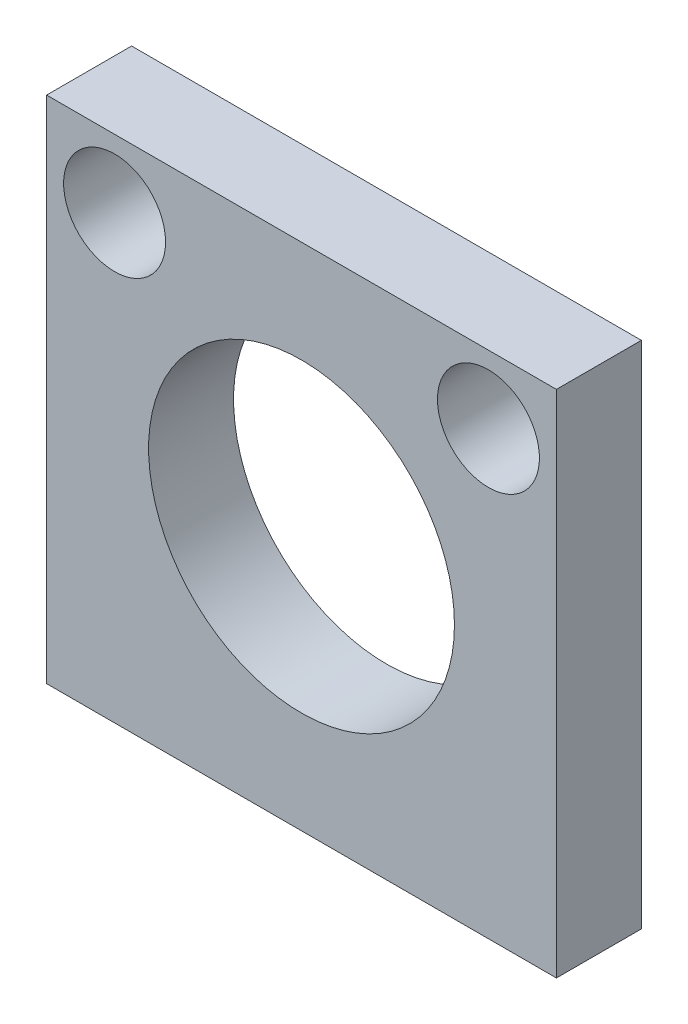
ISO-10303-21;
HEADER;
FILE_DESCRIPTION(('STEP AP214'),'2;1');
FILE_NAME('part.step','',(''),(''),'','','');
FILE_SCHEMA(('AUTOMOTIVE_DESIGN { 1 0 10303 214 1 1 1 1 }'));
ENDSEC;
DATA;
#1=APPLICATION_CONTEXT('core data for automotive mechanical design processes');
#2=APPLICATION_PROTOCOL_DEFINITION('international standard','automotive_design',2000,#1);
#3=PRODUCT_CONTEXT('',#1,'mechanical');
#4=PRODUCT('Part','Part','',(#3));
#5=PRODUCT_RELATED_PRODUCT_CATEGORY('part','',(#4));
#6=PRODUCT_DEFINITION_FORMATION('','',#4);
#7=PRODUCT_DEFINITION_CONTEXT('part definition',#1,'design');
#8=PRODUCT_DEFINITION('design','',#6,#7);
#9=PRODUCT_DEFINITION_SHAPE('','',#8);
#10=(LENGTH_UNIT() NAMED_UNIT(*) SI_UNIT(.MILLI.,.METRE.));
#11=(NAMED_UNIT(*) PLANE_ANGLE_UNIT() SI_UNIT($,.RADIAN.));
#12=(NAMED_UNIT(*) SI_UNIT($,.STERADIAN.) SOLID_ANGLE_UNIT());
#13=UNCERTAINTY_MEASURE_WITH_UNIT(LENGTH_MEASURE(1.E-05),#10,'distance_accuracy_value','');
#14=(GEOMETRIC_REPRESENTATION_CONTEXT(3) GLOBAL_UNCERTAINTY_ASSIGNED_CONTEXT((#13)) GLOBAL_UNIT_ASSIGNED_CONTEXT((#10,
#11,#12)) REPRESENTATION_CONTEXT('',''));
#15=CARTESIAN_POINT('',(0.,0.,0.));
#16=DIRECTION('',(0.,0.,1.));
#17=DIRECTION('',(1.,0.,0.));
#18=AXIS2_PLACEMENT_3D('',#15,#16,#17);
#19=CARTESIAN_POINT('',(0.,0.,5.));
#20=DIRECTION('',(0.,0.,1.));
#21=DIRECTION('',(1.,0.,0.));
#22=AXIS2_PLACEMENT_3D('',#19,#20,#21);
#23=PLANE('',#22);
#24=CARTESIAN_POINT('',(0.,0.,5.));
#25=DIRECTION('',(0.,0.,1.));
#26=DIRECTION('',(1.,0.,0.));
#27=AXIS2_PLACEMENT_3D('',#24,#25,#26);
#28=CIRCLE('',#27,9.);
#29=CARTESIAN_POINT('',(9.,0.,5.));
#30=VERTEX_POINT('',#29);
#31=EDGE_CURVE('E126',#30,#30,#28,.T.);
#32=ORIENTED_EDGE('',*,*,#31,.F.);
#33=EDGE_LOOP('',(#32));
#34=FACE_BOUND('',#33,.T.);
#35=CARTESIAN_POINT('',(-11.,11.,5.));
#36=DIRECTION('',(0.,0.,1.));
#37=DIRECTION('',(1.,0.,0.));
#38=AXIS2_PLACEMENT_3D('',#35,#36,#37);
#39=CIRCLE('',#38,3.);
#40=CARTESIAN_POINT('',(-7.99999999999999,11.,5.));
#41=VERTEX_POINT('',#40);
#42=EDGE_CURVE('E102',#41,#41,#39,.T.);
#43=ORIENTED_EDGE('',*,*,#42,.F.);
#44=EDGE_LOOP('',(#43));
#45=FACE_BOUND('',#44,.T.);
#46=DIRECTION('',(0.,1.,0.));
#47=VECTOR('',#46,1.);
#48=CARTESIAN_POINT('',(15.,15.,5.));
#49=LINE('',#48,#47);
#50=CARTESIAN_POINT('',(15.,-15.,5.));
#51=VERTEX_POINT('',#50);
#52=CARTESIAN_POINT('',(15.,15.,5.));
#53=VERTEX_POINT('',#52);
#54=EDGE_CURVE('E87',#51,#53,#49,.T.);
#55=ORIENTED_EDGE('',*,*,#54,.T.);
#56=DIRECTION('',(-1.,0.,0.));
#57=VECTOR('',#56,1.);
#58=CARTESIAN_POINT('',(-15.,15.,5.));
#59=LINE('',#58,#57);
#60=CARTESIAN_POINT('',(-15.,15.,5.));
#61=VERTEX_POINT('',#60);
#62=EDGE_CURVE('E82',#53,#61,#59,.T.);
#63=ORIENTED_EDGE('',*,*,#62,.T.);
#64=DIRECTION('',(0.,-1.,0.));
#65=VECTOR('',#64,1.);
#66=CARTESIAN_POINT('',(-15.,15.,5.));
#67=LINE('',#66,#65);
#68=CARTESIAN_POINT('',(-15.,-15.,5.));
#69=VERTEX_POINT('',#68);
#70=EDGE_CURVE('E85',#61,#69,#67,.T.);
#71=ORIENTED_EDGE('',*,*,#70,.T.);
#72=DIRECTION('',(1.,0.,0.));
#73=VECTOR('',#72,1.);
#74=CARTESIAN_POINT('',(-15.,-15.,5.));
#75=LINE('',#74,#73);
#76=EDGE_CURVE('E52',#69,#51,#75,.T.);
#77=ORIENTED_EDGE('',*,*,#76,.T.);
#78=EDGE_LOOP('',(#55,#63,#71,#77));
#79=FACE_BOUND('',#78,.T.);
#80=CARTESIAN_POINT('',(11.,11.,5.));
#81=DIRECTION('',(0.,0.,1.));
#82=DIRECTION('',(-1.,0.,0.));
#83=AXIS2_PLACEMENT_3D('',#80,#81,#82);
#84=CIRCLE('',#83,3.);
#85=CARTESIAN_POINT('',(7.99999999999999,11.,5.));
#86=VERTEX_POINT('',#85);
#87=EDGE_CURVE('E117',#86,#86,#84,.T.);
#88=ORIENTED_EDGE('',*,*,#87,.F.);
#89=EDGE_LOOP('',(#88));
#90=FACE_BOUND('',#89,.T.);
#91=ADVANCED_FACE('F35',(#34,#45,#79,#90),#23,.T.);
#92=CARTESIAN_POINT('',(0.,0.,0.));
#93=DIRECTION('',(0.,0.,1.));
#94=DIRECTION('',(1.,0.,0.));
#95=AXIS2_PLACEMENT_3D('',#92,#93,#94);
#96=PLANE('',#95);
#97=CARTESIAN_POINT('',(0.,0.,0.));
#98=DIRECTION('',(0.,0.,1.));
#99=DIRECTION('',(1.,0.,0.));
#100=AXIS2_PLACEMENT_3D('',#97,#98,#99);
#101=CIRCLE('',#100,9.);
#102=CARTESIAN_POINT('',(9.,0.,0.));
#103=VERTEX_POINT('',#102);
#104=EDGE_CURVE('E123',#103,#103,#101,.T.);
#105=ORIENTED_EDGE('',*,*,#104,.T.);
#106=EDGE_LOOP('',(#105));
#107=FACE_BOUND('',#106,.T.);
#108=CARTESIAN_POINT('',(-11.,11.,0.));
#109=DIRECTION('',(0.,0.,1.));
#110=DIRECTION('',(1.,0.,0.));
#111=AXIS2_PLACEMENT_3D('',#108,#109,#110);
#112=CIRCLE('',#111,3.);
#113=CARTESIAN_POINT('',(-7.99999999999999,11.,0.));
#114=VERTEX_POINT('',#113);
#115=EDGE_CURVE('E114',#114,#114,#112,.T.);
#116=ORIENTED_EDGE('',*,*,#115,.T.);
#117=EDGE_LOOP('',(#116));
#118=FACE_BOUND('',#117,.T.);
#119=DIRECTION('',(0.,1.,0.));
#120=VECTOR('',#119,1.);
#121=CARTESIAN_POINT('',(15.,15.,0.));
#122=LINE('',#121,#120);
#123=CARTESIAN_POINT('',(15.,-15.,0.));
#124=VERTEX_POINT('',#123);
#125=CARTESIAN_POINT('',(15.,15.,0.));
#126=VERTEX_POINT('',#125);
#127=EDGE_CURVE('E99',#124,#126,#122,.T.);
#128=ORIENTED_EDGE('',*,*,#127,.F.);
#129=DIRECTION('',(1.,0.,0.));
#130=VECTOR('',#129,1.);
#131=CARTESIAN_POINT('',(-15.,-15.,0.));
#132=LINE('',#131,#130);
#133=CARTESIAN_POINT('',(-15.,-15.,0.));
#134=VERTEX_POINT('',#133);
#135=EDGE_CURVE('E75',#134,#124,#132,.T.);
#136=ORIENTED_EDGE('',*,*,#135,.F.);
#137=DIRECTION('',(0.,-1.,0.));
#138=VECTOR('',#137,1.);
#139=CARTESIAN_POINT('',(-15.,15.,0.));
#140=LINE('',#139,#138);
#141=CARTESIAN_POINT('',(-15.,15.,0.));
#142=VERTEX_POINT('',#141);
#143=EDGE_CURVE('E69',#142,#134,#140,.T.);
#144=ORIENTED_EDGE('',*,*,#143,.F.);
#145=DIRECTION('',(-1.,0.,0.));
#146=VECTOR('',#145,1.);
#147=CARTESIAN_POINT('',(-15.,15.,0.));
#148=LINE('',#147,#146);
#149=EDGE_CURVE('E91',#126,#142,#148,.T.);
#150=ORIENTED_EDGE('',*,*,#149,.F.);
#151=EDGE_LOOP('',(#128,#136,#144,#150));
#152=FACE_BOUND('',#151,.T.);
#153=CARTESIAN_POINT('',(11.,11.,0.));
#154=DIRECTION('',(0.,0.,1.));
#155=DIRECTION('',(-1.,0.,0.));
#156=AXIS2_PLACEMENT_3D('',#153,#154,#155);
#157=CIRCLE('',#156,3.);
#158=CARTESIAN_POINT('',(7.99999999999999,11.,0.));
#159=VERTEX_POINT('',#158);
#160=EDGE_CURVE('E120',#159,#159,#157,.T.);
#161=ORIENTED_EDGE('',*,*,#160,.T.);
#162=EDGE_LOOP('',(#161));
#163=FACE_BOUND('',#162,.T.);
#164=ADVANCED_FACE('F110',(#107,#118,#152,#163),#96,.F.);
#165=CARTESIAN_POINT('',(15.,15.,5.));
#166=DIRECTION('',(-1.,0.,0.));
#167=DIRECTION('',(0.,-1.,0.));
#168=AXIS2_PLACEMENT_3D('',#165,#166,#167);
#169=PLANE('',#168);
#170=ORIENTED_EDGE('',*,*,#127,.T.);
#171=DIRECTION('',(0.,0.,-1.));
#172=VECTOR('',#171,1.);
#173=CARTESIAN_POINT('',(15.,15.,5.));
#174=LINE('',#173,#172);
#175=EDGE_CURVE('E11',#53,#126,#174,.T.);
#176=ORIENTED_EDGE('',*,*,#175,.F.);
#177=ORIENTED_EDGE('',*,*,#54,.F.);
#178=DIRECTION('',(0.,0.,-1.));
#179=VECTOR('',#178,1.);
#180=CARTESIAN_POINT('',(15.,-15.,5.));
#181=LINE('',#180,#179);
#182=EDGE_CURVE('E95',#51,#124,#181,.T.);
#183=ORIENTED_EDGE('',*,*,#182,.T.);
#184=EDGE_LOOP('',(#170,#176,#177,#183));
#185=FACE_BOUND('',#184,.T.);
#186=ADVANCED_FACE('F37',(#185),#169,.F.);
#187=CARTESIAN_POINT('',(-15.,15.,5.));
#188=DIRECTION('',(0.,-1.,0.));
#189=DIRECTION('',(0.,0.,-1.));
#190=AXIS2_PLACEMENT_3D('',#187,#188,#189);
#191=PLANE('',#190);
#192=ORIENTED_EDGE('',*,*,#149,.T.);
#193=DIRECTION('',(0.,0.,-1.));
#194=VECTOR('',#193,1.);
#195=CARTESIAN_POINT('',(-15.,15.,5.));
#196=LINE('',#195,#194);
#197=EDGE_CURVE('E44',#61,#142,#196,.T.);
#198=ORIENTED_EDGE('',*,*,#197,.F.);
#199=ORIENTED_EDGE('',*,*,#62,.F.);
#200=ORIENTED_EDGE('',*,*,#175,.T.);
#201=EDGE_LOOP('',(#192,#198,#199,#200));
#202=FACE_BOUND('',#201,.T.);
#203=ADVANCED_FACE('F90',(#202),#191,.F.);
#204=CARTESIAN_POINT('',(-15.,15.,5.));
#205=DIRECTION('',(1.,0.,0.));
#206=DIRECTION('',(0.,1.,0.));
#207=AXIS2_PLACEMENT_3D('',#204,#205,#206);
#208=PLANE('',#207);
#209=ORIENTED_EDGE('',*,*,#143,.T.);
#210=DIRECTION('',(0.,0.,-1.));
#211=VECTOR('',#210,1.);
#212=CARTESIAN_POINT('',(-15.,-15.,5.));
#213=LINE('',#212,#211);
#214=EDGE_CURVE('E92',#69,#134,#213,.T.);
#215=ORIENTED_EDGE('',*,*,#214,.F.);
#216=ORIENTED_EDGE('',*,*,#70,.F.);
#217=ORIENTED_EDGE('',*,*,#197,.T.);
#218=EDGE_LOOP('',(#209,#215,#216,#217));
#219=FACE_BOUND('',#218,.T.);
#220=ADVANCED_FACE('F93',(#219),#208,.F.);
#221=CARTESIAN_POINT('',(-15.,-15.,5.));
#222=DIRECTION('',(0.,1.,0.));
#223=DIRECTION('',(0.,0.,1.));
#224=AXIS2_PLACEMENT_3D('',#221,#222,#223);
#225=PLANE('',#224);
#226=ORIENTED_EDGE('',*,*,#135,.T.);
#227=ORIENTED_EDGE('',*,*,#182,.F.);
#228=ORIENTED_EDGE('',*,*,#76,.F.);
#229=ORIENTED_EDGE('',*,*,#214,.T.);
#230=EDGE_LOOP('',(#226,#227,#228,#229));
#231=FACE_BOUND('',#230,.T.);
#232=ADVANCED_FACE('F107',(#231),#225,.F.);
#233=CARTESIAN_POINT('',(-11.,11.,5.));
#234=DIRECTION('',(0.,0.,-1.));
#235=DIRECTION('',(-1.,0.,0.));
#236=AXIS2_PLACEMENT_3D('',#233,#234,#235);
#237=CYLINDRICAL_SURFACE('',#236,3.);
#238=ORIENTED_EDGE('',*,*,#42,.T.);
#239=EDGE_LOOP('',(#238));
#240=FACE_BOUND('',#239,.T.);
#241=ORIENTED_EDGE('',*,*,#115,.F.);
#242=EDGE_LOOP('',(#241));
#243=FACE_BOUND('',#242,.T.);
#244=ADVANCED_FACE('F146',(#240,#243),#237,.F.);
#245=CARTESIAN_POINT('',(11.,11.,5.));
#246=DIRECTION('',(0.,0.,-1.));
#247=DIRECTION('',(-1.,0.,0.));
#248=AXIS2_PLACEMENT_3D('',#245,#246,#247);
#249=CYLINDRICAL_SURFACE('',#248,3.);
#250=ORIENTED_EDGE('',*,*,#87,.T.);
#251=EDGE_LOOP('',(#250));
#252=FACE_BOUND('',#251,.T.);
#253=ORIENTED_EDGE('',*,*,#160,.F.);
#254=EDGE_LOOP('',(#253));
#255=FACE_BOUND('',#254,.T.);
#256=ADVANCED_FACE('F137',(#252,#255),#249,.F.);
#257=CARTESIAN_POINT('',(0.,0.,0.));
#258=DIRECTION('',(0.,0.,1.));
#259=DIRECTION('',(1.,0.,0.));
#260=AXIS2_PLACEMENT_3D('',#257,#258,#259);
#261=CYLINDRICAL_SURFACE('',#260,9.);
#262=ORIENTED_EDGE('',*,*,#104,.F.);
#263=EDGE_LOOP('',(#262));
#264=FACE_BOUND('',#263,.T.);
#265=ORIENTED_EDGE('',*,*,#31,.T.);
#266=EDGE_LOOP('',(#265));
#267=FACE_BOUND('',#266,.T.);
#268=ADVANCED_FACE('F134',(#264,#267),#261,.F.);
#269=CLOSED_SHELL('',(#91,#164,#186,#203,#220,#232,#244,#256,#268));
#270=MANIFOLD_SOLID_BREP('B2',#269);
#271=ADVANCED_BREP_SHAPE_REPRESENTATION('',(#18,#270),#14);
#272=SHAPE_DEFINITION_REPRESENTATION(#9,#271);
ENDSEC;
END-ISO-10303-21;
